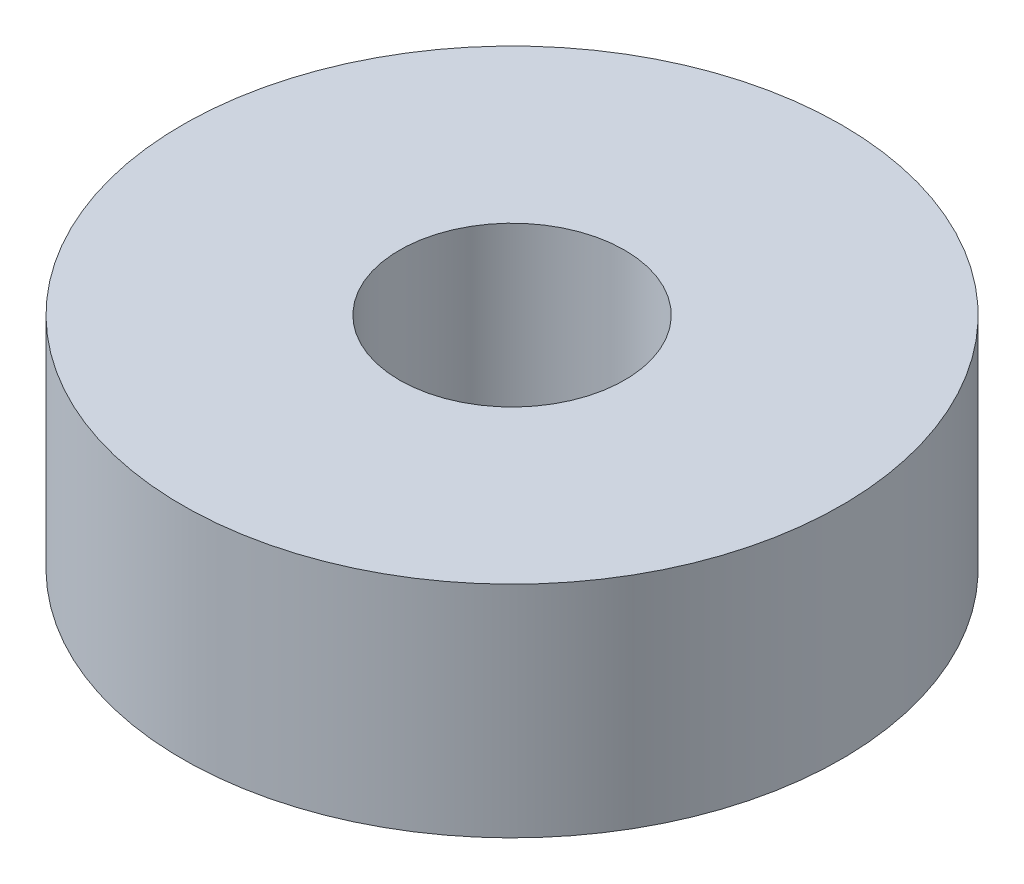
ISO-10303-21;
HEADER;
FILE_DESCRIPTION(('STEP AP214'),'2;1');
FILE_NAME('part.step','',(''),(''),'','','');
FILE_SCHEMA(('AUTOMOTIVE_DESIGN { 1 0 10303 214 1 1 1 1 }'));
ENDSEC;
DATA;
#1=APPLICATION_CONTEXT('core data for automotive mechanical design processes');
#2=APPLICATION_PROTOCOL_DEFINITION('international standard','automotive_design',2000,#1);
#3=PRODUCT_CONTEXT('',#1,'mechanical');
#4=PRODUCT('Part','Part','',(#3));
#5=PRODUCT_RELATED_PRODUCT_CATEGORY('part','',(#4));
#6=PRODUCT_DEFINITION_FORMATION('','',#4);
#7=PRODUCT_DEFINITION_CONTEXT('part definition',#1,'design');
#8=PRODUCT_DEFINITION('design','',#6,#7);
#9=PRODUCT_DEFINITION_SHAPE('','',#8);
#10=(LENGTH_UNIT() NAMED_UNIT(*) SI_UNIT(.MILLI.,.METRE.));
#11=(NAMED_UNIT(*) PLANE_ANGLE_UNIT() SI_UNIT($,.RADIAN.));
#12=(NAMED_UNIT(*) SI_UNIT($,.STERADIAN.) SOLID_ANGLE_UNIT());
#13=UNCERTAINTY_MEASURE_WITH_UNIT(LENGTH_MEASURE(1.E-05),#10,'distance_accuracy_value','');
#14=(GEOMETRIC_REPRESENTATION_CONTEXT(3) GLOBAL_UNCERTAINTY_ASSIGNED_CONTEXT((#13)) GLOBAL_UNIT_ASSIGNED_CONTEXT((#10,
#11,#12)) REPRESENTATION_CONTEXT('',''));
#15=CARTESIAN_POINT('',(0.,0.,0.));
#16=DIRECTION('',(0.,0.,1.));
#17=DIRECTION('',(1.,0.,0.));
#18=AXIS2_PLACEMENT_3D('',#15,#16,#17);
#19=CARTESIAN_POINT('',(0.,0.,0.));
#20=DIRECTION('',(0.,1.,0.));
#21=DIRECTION('',(0.,0.,1.));
#22=AXIS2_PLACEMENT_3D('',#19,#20,#21);
#23=PLANE('',#22);
#24=CARTESIAN_POINT('',(0.,0.,0.));
#25=DIRECTION('',(0.,-1.,0.));
#26=DIRECTION('',(0.,0.,-1.));
#27=AXIS2_PLACEMENT_3D('',#24,#25,#26);
#28=CIRCLE('',#27,2.05);
#29=CARTESIAN_POINT('',(0.,0.,-2.05));
#30=VERTEX_POINT('',#29);
#31=EDGE_CURVE('E26',#30,#30,#28,.F.);
#32=ORIENTED_EDGE('',*,*,#31,.T.);
#33=EDGE_LOOP('',(#32));
#34=FACE_BOUND('',#33,.T.);
#35=CARTESIAN_POINT('',(0.,0.,0.));
#36=DIRECTION('',(0.,-1.,0.));
#37=DIRECTION('',(0.,0.,-1.));
#38=AXIS2_PLACEMENT_3D('',#35,#36,#37);
#39=CIRCLE('',#38,6.);
#40=CARTESIAN_POINT('',(0.,0.,-6.));
#41=VERTEX_POINT('',#40);
#42=EDGE_CURVE('E17',#41,#41,#39,.F.);
#43=ORIENTED_EDGE('',*,*,#42,.F.);
#44=EDGE_LOOP('',(#43));
#45=FACE_BOUND('',#44,.T.);
#46=ADVANCED_FACE('F14',(#34,#45),#23,.F.);
#47=CARTESIAN_POINT('',(0.,4.,0.));
#48=DIRECTION('',(0.,-1.,0.));
#49=DIRECTION('',(0.,0.,-1.));
#50=AXIS2_PLACEMENT_3D('',#47,#48,#49);
#51=CYLINDRICAL_SURFACE('',#50,6.);
#52=ORIENTED_EDGE('',*,*,#42,.T.);
#53=EDGE_LOOP('',(#52));
#54=FACE_BOUND('',#53,.T.);
#55=CARTESIAN_POINT('',(0.,4.,0.));
#56=DIRECTION('',(0.,-1.,0.));
#57=DIRECTION('',(0.,0.,-1.));
#58=AXIS2_PLACEMENT_3D('',#55,#56,#57);
#59=CIRCLE('',#58,6.);
#60=CARTESIAN_POINT('',(0.,4.,-6.));
#61=VERTEX_POINT('',#60);
#62=EDGE_CURVE('E21',#61,#61,#59,.F.);
#63=ORIENTED_EDGE('',*,*,#62,.F.);
#64=EDGE_LOOP('',(#63));
#65=FACE_BOUND('',#64,.T.);
#66=ADVANCED_FACE('F34',(#54,#65),#51,.T.);
#67=CARTESIAN_POINT('',(0.,4.,0.));
#68=DIRECTION('',(0.,-1.,0.));
#69=DIRECTION('',(0.,0.,-1.));
#70=AXIS2_PLACEMENT_3D('',#67,#68,#69);
#71=CYLINDRICAL_SURFACE('',#70,2.05);
#72=CARTESIAN_POINT('',(0.,4.,0.));
#73=DIRECTION('',(0.,-1.,0.));
#74=DIRECTION('',(0.,0.,-1.));
#75=AXIS2_PLACEMENT_3D('',#72,#73,#74);
#76=CIRCLE('',#75,2.05);
#77=CARTESIAN_POINT('',(0.,4.,-2.05));
#78=VERTEX_POINT('',#77);
#79=EDGE_CURVE('E10',#78,#78,#76,.T.);
#80=ORIENTED_EDGE('',*,*,#79,.F.);
#81=EDGE_LOOP('',(#80));
#82=FACE_BOUND('',#81,.T.);
#83=ORIENTED_EDGE('',*,*,#31,.F.);
#84=EDGE_LOOP('',(#83));
#85=FACE_BOUND('',#84,.T.);
#86=ADVANCED_FACE('F42',(#82,#85),#71,.F.);
#87=CARTESIAN_POINT('',(0.,4.,0.));
#88=DIRECTION('',(0.,1.,0.));
#89=DIRECTION('',(0.,0.,1.));
#90=AXIS2_PLACEMENT_3D('',#87,#88,#89);
#91=PLANE('',#90);
#92=ORIENTED_EDGE('',*,*,#79,.T.);
#93=EDGE_LOOP('',(#92));
#94=FACE_BOUND('',#93,.T.);
#95=ORIENTED_EDGE('',*,*,#62,.T.);
#96=EDGE_LOOP('',(#95));
#97=FACE_BOUND('',#96,.T.);
#98=ADVANCED_FACE('F43',(#94,#97),#91,.T.);
#99=CLOSED_SHELL('',(#46,#66,#86,#98));
#100=MANIFOLD_SOLID_BREP('B1',#99);
#101=ADVANCED_BREP_SHAPE_REPRESENTATION('',(#18,#100),#14);
#102=SHAPE_DEFINITION_REPRESENTATION(#9,#101);
ENDSEC;
END-ISO-10303-21;
